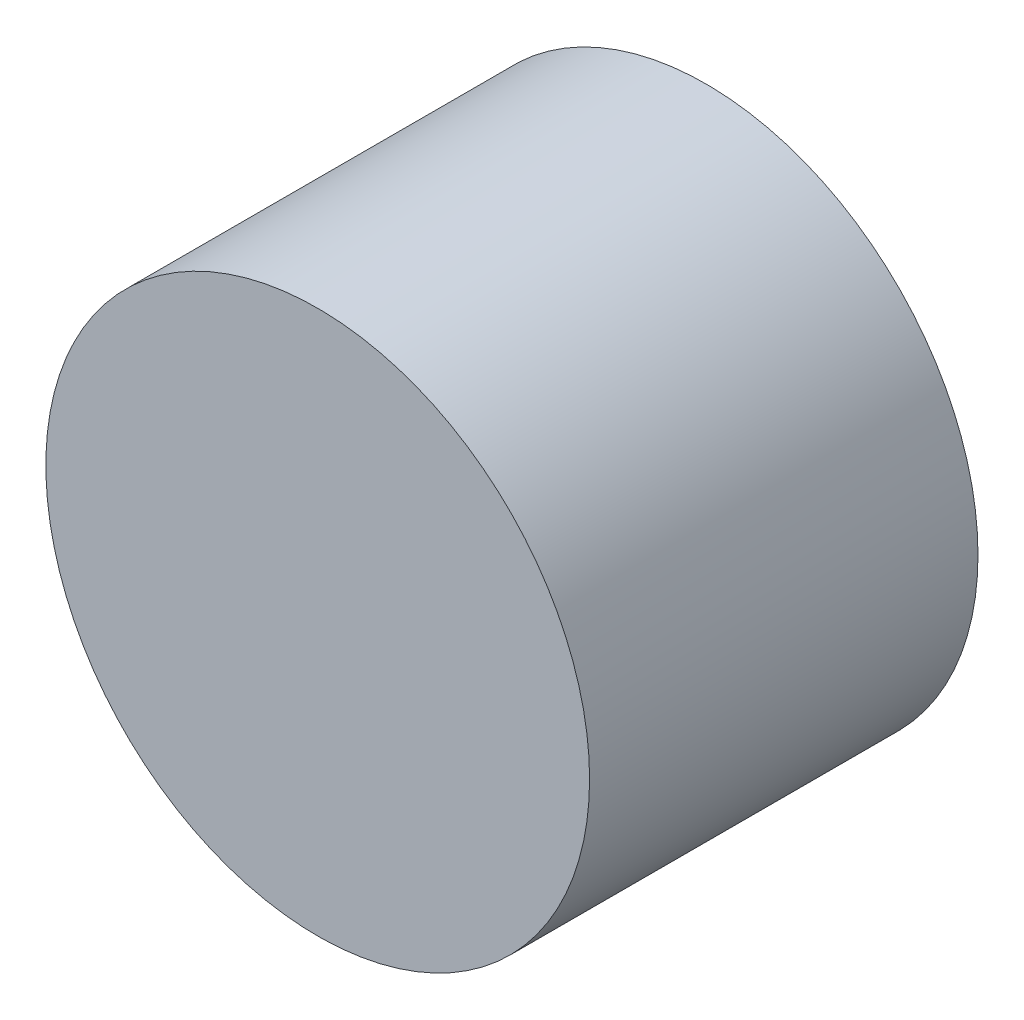
ISO-10303-21;
HEADER;
FILE_DESCRIPTION(('STEP AP214'),'2;1');
FILE_NAME('part.step','',(''),(''),'','','');
FILE_SCHEMA(('AUTOMOTIVE_DESIGN { 1 0 10303 214 1 1 1 1 }'));
ENDSEC;
DATA;
#1=APPLICATION_CONTEXT('core data for automotive mechanical design processes');
#2=APPLICATION_PROTOCOL_DEFINITION('international standard','automotive_design',2000,#1);
#3=PRODUCT_CONTEXT('',#1,'mechanical');
#4=PRODUCT('Part','Part','',(#3));
#5=PRODUCT_RELATED_PRODUCT_CATEGORY('part','',(#4));
#6=PRODUCT_DEFINITION_FORMATION('','',#4);
#7=PRODUCT_DEFINITION_CONTEXT('part definition',#1,'design');
#8=PRODUCT_DEFINITION('design','',#6,#7);
#9=PRODUCT_DEFINITION_SHAPE('','',#8);
#10=(LENGTH_UNIT() NAMED_UNIT(*) SI_UNIT(.MILLI.,.METRE.));
#11=(NAMED_UNIT(*) PLANE_ANGLE_UNIT() SI_UNIT($,.RADIAN.));
#12=(NAMED_UNIT(*) SI_UNIT($,.STERADIAN.) SOLID_ANGLE_UNIT());
#13=UNCERTAINTY_MEASURE_WITH_UNIT(LENGTH_MEASURE(1.E-05),#10,'distance_accuracy_value','');
#14=(GEOMETRIC_REPRESENTATION_CONTEXT(3) GLOBAL_UNCERTAINTY_ASSIGNED_CONTEXT((#13)) GLOBAL_UNIT_ASSIGNED_CONTEXT((#10,
#11,#12)) REPRESENTATION_CONTEXT('',''));
#15=CARTESIAN_POINT('',(0.,0.,0.));
#16=DIRECTION('',(0.,0.,1.));
#17=DIRECTION('',(1.,0.,0.));
#18=AXIS2_PLACEMENT_3D('',#15,#16,#17);
#19=CARTESIAN_POINT('',(0.,0.,5.));
#20=DIRECTION('',(0.,0.,-1.));
#21=DIRECTION('',(-1.,0.,0.));
#22=AXIS2_PLACEMENT_3D('',#19,#20,#21);
#23=CYLINDRICAL_SURFACE('',#22,3.5);
#24=CARTESIAN_POINT('',(0.,0.,5.));
#25=DIRECTION('',(0.,0.,1.));
#26=DIRECTION('',(1.,0.,0.));
#27=AXIS2_PLACEMENT_3D('',#24,#25,#26);
#28=CIRCLE('',#27,3.5);
#29=CARTESIAN_POINT('',(3.5,0.,5.));
#30=VERTEX_POINT('',#29);
#31=EDGE_CURVE('E10',#30,#30,#28,.T.);
#32=ORIENTED_EDGE('',*,*,#31,.F.);
#33=EDGE_LOOP('',(#32));
#34=FACE_BOUND('',#33,.T.);
#35=CARTESIAN_POINT('',(0.,0.,0.));
#36=DIRECTION('',(0.,0.,1.));
#37=DIRECTION('',(1.,0.,0.));
#38=AXIS2_PLACEMENT_3D('',#35,#36,#37);
#39=CIRCLE('',#38,3.5);
#40=CARTESIAN_POINT('',(3.5,0.,0.));
#41=VERTEX_POINT('',#40);
#42=EDGE_CURVE('E40',#41,#41,#39,.T.);
#43=ORIENTED_EDGE('',*,*,#42,.T.);
#44=EDGE_LOOP('',(#43));
#45=FACE_BOUND('',#44,.T.);
#46=ADVANCED_FACE('F37',(#34,#45),#23,.T.);
#47=CARTESIAN_POINT('',(0.,0.,5.));
#48=DIRECTION('',(0.,0.,1.));
#49=DIRECTION('',(1.,0.,0.));
#50=AXIS2_PLACEMENT_3D('',#47,#48,#49);
#51=PLANE('',#50);
#52=ORIENTED_EDGE('',*,*,#31,.T.);
#53=EDGE_LOOP('',(#52));
#54=FACE_BOUND('',#53,.T.);
#55=ADVANCED_FACE('F54',(#54),#51,.T.);
#56=CARTESIAN_POINT('',(0.,0.,0.));
#57=DIRECTION('',(0.,0.,1.));
#58=DIRECTION('',(1.,0.,0.));
#59=AXIS2_PLACEMENT_3D('',#56,#57,#58);
#60=PLANE('',#59);
#61=ORIENTED_EDGE('',*,*,#42,.F.);
#62=EDGE_LOOP('',(#61));
#63=FACE_BOUND('',#62,.T.);
#64=ADVANCED_FACE('F52',(#63),#60,.F.);
#65=CLOSED_SHELL('',(#46,#55,#64));
#66=MANIFOLD_SOLID_BREP('B2',#65);
#67=ADVANCED_BREP_SHAPE_REPRESENTATION('',(#18,#66),#14);
#68=SHAPE_DEFINITION_REPRESENTATION(#9,#67);
ENDSEC;
END-ISO-10303-21;
